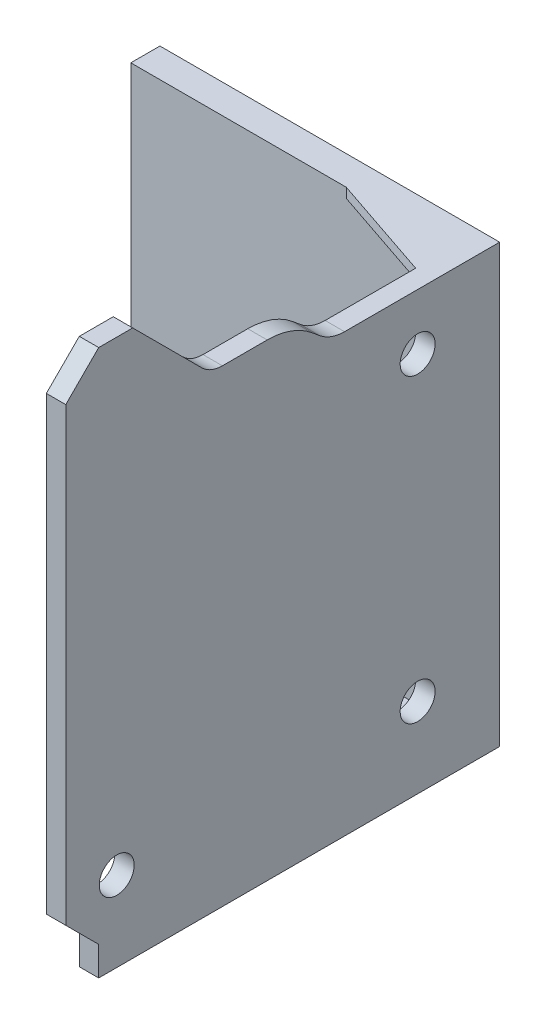
ISO-10303-21;
HEADER;
FILE_DESCRIPTION(('STEP AP214'),'2;1');
FILE_NAME('part.step','',(''),(''),'','','');
FILE_SCHEMA(('AUTOMOTIVE_DESIGN { 1 0 10303 214 1 1 1 1 }'));
ENDSEC;
DATA;
#1=APPLICATION_CONTEXT('core data for automotive mechanical design processes');
#2=APPLICATION_PROTOCOL_DEFINITION('international standard','automotive_design',2000,#1);
#3=PRODUCT_CONTEXT('',#1,'mechanical');
#4=PRODUCT('Part','Part','',(#3));
#5=PRODUCT_RELATED_PRODUCT_CATEGORY('part','',(#4));
#6=PRODUCT_DEFINITION_FORMATION('','',#4);
#7=PRODUCT_DEFINITION_CONTEXT('part definition',#1,'design');
#8=PRODUCT_DEFINITION('design','',#6,#7);
#9=PRODUCT_DEFINITION_SHAPE('','',#8);
#10=(LENGTH_UNIT() NAMED_UNIT(*) SI_UNIT(.MILLI.,.METRE.));
#11=(NAMED_UNIT(*) PLANE_ANGLE_UNIT() SI_UNIT($,.RADIAN.));
#12=(NAMED_UNIT(*) SI_UNIT($,.STERADIAN.) SOLID_ANGLE_UNIT());
#13=UNCERTAINTY_MEASURE_WITH_UNIT(LENGTH_MEASURE(1.E-05),#10,'distance_accuracy_value','');
#14=(GEOMETRIC_REPRESENTATION_CONTEXT(3) GLOBAL_UNCERTAINTY_ASSIGNED_CONTEXT((#13)) GLOBAL_UNIT_ASSIGNED_CONTEXT((#10,
#11,#12)) REPRESENTATION_CONTEXT('',''));
#15=CARTESIAN_POINT('',(0.,0.,0.));
#16=DIRECTION('',(0.,0.,1.));
#17=DIRECTION('',(1.,0.,0.));
#18=AXIS2_PLACEMENT_3D('',#15,#16,#17);
#19=CARTESIAN_POINT('',(34.8950034964941,303.179756404235,218.512693009187));
#20=DIRECTION('',(1.,0.,0.));
#21=DIRECTION('',(0.,1.,0.));
#22=AXIS2_PLACEMENT_3D('',#19,#20,#21);
#23=PLANE('',#22);
#24=DIRECTION('',(0.,0.,1.));
#25=VECTOR('',#24,1.);
#26=CARTESIAN_POINT('',(34.8950034964941,254.429756404235,212.102389971154));
#27=LINE('',#26,#25);
#28=CARTESIAN_POINT('',(34.8950034964941,254.429756404235,192.949446246001));
#29=VERTEX_POINT('',#28);
#30=CARTESIAN_POINT('',(34.8950034964941,254.429756404235,212.102389971154));
#31=VERTEX_POINT('',#30);
#32=EDGE_CURVE('E672',#29,#31,#27,.T.);
#33=ORIENTED_EDGE('',*,*,#32,.T.);
#34=DIRECTION('',(0.,-1.,0.));
#35=VECTOR('',#34,1.);
#36=CARTESIAN_POINT('',(34.8950034964941,254.429756404235,212.102389971154));
#37=LINE('',#36,#35);
#38=CARTESIAN_POINT('',(34.8950034964941,251.929756404235,212.102389971154));
#39=VERTEX_POINT('',#38);
#40=EDGE_CURVE('E208',#31,#39,#37,.T.);
#41=ORIENTED_EDGE('',*,*,#40,.T.);
#42=DIRECTION('',(0.,0.,-1.));
#43=VECTOR('',#42,1.);
#44=CARTESIAN_POINT('',(34.8950034964941,251.929756404235,192.949446246001));
#45=LINE('',#44,#43);
#46=CARTESIAN_POINT('',(34.8950034964941,251.929756404235,231.255333696306));
#47=VERTEX_POINT('',#46);
#48=EDGE_CURVE('E214',#47,#39,#45,.T.);
#49=ORIENTED_EDGE('',*,*,#48,.F.);
#50=DIRECTION('',(0.,-1.,0.));
#51=VECTOR('',#50,1.);
#52=CARTESIAN_POINT('',(34.8950034964941,254.929856404235,231.255333696306));
#53=LINE('',#52,#51);
#54=CARTESIAN_POINT('',(34.8950034964941,254.929756404235,231.255333696306));
#55=VERTEX_POINT('',#54);
#56=EDGE_CURVE('E219',#55,#47,#53,.T.);
#57=ORIENTED_EDGE('',*,*,#56,.F.);
#58=DIRECTION('',(0.,-0.707106781186553,-0.707106781186542));
#59=VECTOR('',#58,1.);
#60=CARTESIAN_POINT('',(34.8950034964941,258.32386895393,234.649446246001));
#61=LINE('',#60,#59);
#62=CARTESIAN_POINT('',(34.8950034964941,258.32386895393,234.649446246001));
#63=VERTEX_POINT('',#62);
#64=EDGE_CURVE('E270',#63,#55,#61,.T.);
#65=ORIENTED_EDGE('',*,*,#64,.F.);
#66=DIRECTION('',(0.,-1.,0.));
#67=VECTOR('',#66,1.);
#68=CARTESIAN_POINT('',(34.8950034964941,304.78564385454,234.649446246001));
#69=LINE('',#68,#67);
#70=CARTESIAN_POINT('',(34.8950034964941,304.78564385454,234.649446246001));
#71=VERTEX_POINT('',#70);
#72=EDGE_CURVE('E312',#71,#63,#69,.T.);
#73=ORIENTED_EDGE('',*,*,#72,.F.);
#74=DIRECTION('',(0.,-0.70710678118655,0.707106781186545));
#75=VECTOR('',#74,1.);
#76=CARTESIAN_POINT('',(34.8950034964941,304.78564385454,234.649446246001));
#77=LINE('',#76,#75);
#78=CARTESIAN_POINT('',(34.8950034964941,308.179756404235,231.255333696306));
#79=VERTEX_POINT('',#78);
#80=EDGE_CURVE('E310',#79,#71,#77,.T.);
#81=ORIENTED_EDGE('',*,*,#80,.F.);
#82=DIRECTION('',(0.,0.,1.));
#83=VECTOR('',#82,1.);
#84=CARTESIAN_POINT('',(34.8950034964941,308.179756404235,227.755333696306));
#85=LINE('',#84,#83);
#86=CARTESIAN_POINT('',(34.8950034964941,308.179756404235,227.755333696306));
#87=VERTEX_POINT('',#86);
#88=EDGE_CURVE('E308',#87,#79,#85,.T.);
#89=ORIENTED_EDGE('',*,*,#88,.F.);
#90=DIRECTION('',(0.,0.707106781186542,0.707106781186553));
#91=VECTOR('',#90,1.);
#92=CARTESIAN_POINT('',(34.8950034964941,308.179756404235,227.755333696306));
#93=LINE('',#92,#91);
#94=CARTESIAN_POINT('',(34.8950034964941,301.058436060675,220.634013352746));
#95=VERTEX_POINT('',#94);
#96=EDGE_CURVE('E306',#95,#87,#93,.T.);
#97=ORIENTED_EDGE('',*,*,#96,.F.);
#98=CARTESIAN_POINT('',(34.8950034964941,303.179756404235,218.512693009187));
#99=DIRECTION('',(-1.,0.,0.));
#100=DIRECTION('',(0.,1.,0.));
#101=AXIS2_PLACEMENT_3D('',#98,#99,#100);
#102=CIRCLE('',#101,3.);
#103=CARTESIAN_POINT('',(34.8950034964941,300.179756404235,218.512693009187));
#104=VERTEX_POINT('',#103);
#105=EDGE_CURVE('E303',#104,#95,#102,.T.);
#106=ORIENTED_EDGE('',*,*,#105,.F.);
#107=DIRECTION('',(0.,0.,1.));
#108=VECTOR('',#107,1.);
#109=CARTESIAN_POINT('',(34.8950034964941,300.179756404235,213.899446246001));
#110=LINE('',#109,#108);
#111=CARTESIAN_POINT('',(34.8950034964941,300.179756404235,213.899446246001));
#112=VERTEX_POINT('',#111);
#113=EDGE_CURVE('E301',#112,#104,#110,.T.);
#114=ORIENTED_EDGE('',*,*,#113,.F.);
#115=CARTESIAN_POINT('',(34.8950034964941,292.929756404235,213.899446246001));
#116=DIRECTION('',(1.,0.,0.));
#117=DIRECTION('',(0.,1.,0.));
#118=AXIS2_PLACEMENT_3D('',#115,#116,#117);
#119=CIRCLE('',#118,7.24999999999999);
#120=CARTESIAN_POINT('',(34.8950034964941,298.498018376654,209.256499056284));
#121=VERTEX_POINT('',#120);
#122=EDGE_CURVE('E299',#121,#112,#119,.T.);
#123=ORIENTED_EDGE('',*,*,#122,.F.);
#124=DIRECTION('',(0.,0.640406508926575,0.768036134126824));
#125=VECTOR('',#124,1.);
#126=CARTESIAN_POINT('',(34.8950034964941,297.857611867728,208.488462922157));
#127=LINE('',#126,#125);
#128=CARTESIAN_POINT('',(34.8950034964941,297.857611867728,208.488462922157));
#129=VERTEX_POINT('',#128);
#130=EDGE_CURVE('E297',#129,#121,#127,.T.);
#131=ORIENTED_EDGE('',*,*,#130,.F.);
#132=CARTESIAN_POINT('',(34.8950034964941,300.929756404235,205.92683688645));
#133=DIRECTION('',(-1.,0.,0.));
#134=DIRECTION('',(0.,1.,0.));
#135=AXIS2_PLACEMENT_3D('',#132,#133,#134);
#136=CIRCLE('',#135,4.00000000000001);
#137=CARTESIAN_POINT('',(34.8950034964941,296.929756404235,205.92683688645));
#138=VERTEX_POINT('',#137);
#139=EDGE_CURVE('E295',#138,#129,#136,.T.);
#140=ORIENTED_EDGE('',*,*,#139,.F.);
#141=DIRECTION('',(0.,0.,1.));
#142=VECTOR('',#141,1.);
#143=CARTESIAN_POINT('',(34.8950034964941,296.929756404235,197.649446246001));
#144=LINE('',#143,#142);
#145=CARTESIAN_POINT('',(34.8950034964941,296.929756404235,196.599446246001));
#146=VERTEX_POINT('',#145);
#147=EDGE_CURVE('E265',#146,#138,#144,.T.);
#148=ORIENTED_EDGE('',*,*,#147,.F.);
#149=DIRECTION('',(0.,1.,0.));
#150=VECTOR('',#149,1.);
#151=CARTESIAN_POINT('',(34.8950034964941,295.929756404235,196.599446246001));
#152=LINE('',#151,#150);
#153=CARTESIAN_POINT('',(34.8950034964941,295.929756404235,196.599446246001));
#154=VERTEX_POINT('',#153);
#155=EDGE_CURVE('E239',#154,#146,#152,.T.);
#156=ORIENTED_EDGE('',*,*,#155,.F.);
#157=DIRECTION('',(0.,0.,-1.));
#158=VECTOR('',#157,1.);
#159=CARTESIAN_POINT('',(34.8950034964941,295.929756404235,196.599446246001));
#160=LINE('',#159,#158);
#161=CARTESIAN_POINT('',(34.8950034964941,295.929756404235,195.449446246001));
#162=VERTEX_POINT('',#161);
#163=EDGE_CURVE('E234',#154,#162,#160,.T.);
#164=ORIENTED_EDGE('',*,*,#163,.T.);
#165=DIRECTION('',(0.,0.707106781186549,0.707106781186546));
#166=VECTOR('',#165,1.);
#167=CARTESIAN_POINT('',(34.8950034964942,50.2401550791165,-50.2401550791166));
#168=LINE('',#167,#166);
#169=CARTESIAN_POINT('',(34.8950034964941,293.429756404235,192.949446246001));
#170=VERTEX_POINT('',#169);
#171=EDGE_CURVE('E225',#170,#162,#168,.T.);
#172=ORIENTED_EDGE('',*,*,#171,.F.);
#173=DIRECTION('',(0.,1.,0.));
#174=VECTOR('',#173,1.);
#175=CARTESIAN_POINT('',(34.8950034964941,296.929756404235,192.949446246001));
#176=LINE('',#175,#174);
#177=EDGE_CURVE('E48',#29,#170,#176,.T.);
#178=ORIENTED_EDGE('',*,*,#177,.F.);
#179=EDGE_LOOP('',(#33,#41,#49,#57,#65,#73,#81,#89,#97,#106,#114,#123,#131,#140,#148,#156,#164,
#172,#178));
#180=FACE_BOUND('',#179,.T.);
#181=CARTESIAN_POINT('',(34.8950034964941,260.179756404235,229.399446246001));
#182=DIRECTION('',(1.,0.,0.));
#183=DIRECTION('',(0.,1.,0.));
#184=AXIS2_PLACEMENT_3D('',#181,#182,#183);
#185=CIRCLE('',#184,1.79999999999994);
#186=CARTESIAN_POINT('',(34.8950034964941,261.979756404235,229.399446246001));
#187=VERTEX_POINT('',#186);
#188=EDGE_CURVE('E249',#187,#187,#185,.T.);
#189=ORIENTED_EDGE('',*,*,#188,.T.);
#190=EDGE_LOOP('',(#189));
#191=FACE_BOUND('',#190,.T.);
#192=CARTESIAN_POINT('',(34.8950034964941,260.179756404235,198.399446246001));
#193=DIRECTION('',(1.,0.,0.));
#194=DIRECTION('',(0.,1.,0.));
#195=AXIS2_PLACEMENT_3D('',#192,#193,#194);
#196=CIRCLE('',#195,1.79999999999989);
#197=CARTESIAN_POINT('',(34.8950034964941,261.979756404235,198.399446246001));
#198=VERTEX_POINT('',#197);
#199=EDGE_CURVE('E253',#198,#198,#196,.T.);
#200=ORIENTED_EDGE('',*,*,#199,.T.);
#201=EDGE_LOOP('',(#200));
#202=FACE_BOUND('',#201,.T.);
#203=CARTESIAN_POINT('',(34.8950034964941,291.179756404235,198.399446246001));
#204=DIRECTION('',(1.,0.,0.));
#205=DIRECTION('',(0.,1.,0.));
#206=AXIS2_PLACEMENT_3D('',#203,#204,#205);
#207=CIRCLE('',#206,1.79999999999989);
#208=CARTESIAN_POINT('',(34.8950034964941,292.979756404235,198.399446246001));
#209=VERTEX_POINT('',#208);
#210=EDGE_CURVE('E259',#209,#209,#207,.T.);
#211=ORIENTED_EDGE('',*,*,#210,.T.);
#212=EDGE_LOOP('',(#211));
#213=FACE_BOUND('',#212,.T.);
#214=ADVANCED_FACE('F33',(#180,#191,#202,#213),#23,.F.);
#215=CARTESIAN_POINT('',(36.8950034964941,303.179756404235,218.512693009187));
#216=DIRECTION('',(1.,0.,0.));
#217=DIRECTION('',(0.,1.,0.));
#218=AXIS2_PLACEMENT_3D('',#215,#216,#217);
#219=PLANE('',#218);
#220=DIRECTION('',(0.,-0.707106781186553,-0.707106781186542));
#221=VECTOR('',#220,1.);
#222=CARTESIAN_POINT('',(36.8950034964941,258.32386895393,234.649446246001));
#223=LINE('',#222,#221);
#224=CARTESIAN_POINT('',(36.8950034964941,258.32386895393,234.649446246001));
#225=VERTEX_POINT('',#224);
#226=CARTESIAN_POINT('',(36.8950034964941,254.929756404235,231.255333696306));
#227=VERTEX_POINT('',#226);
#228=EDGE_CURVE('E290',#225,#227,#223,.T.);
#229=ORIENTED_EDGE('',*,*,#228,.T.);
#230=DIRECTION('',(0.,-1.,0.));
#231=VECTOR('',#230,1.);
#232=CARTESIAN_POINT('',(36.8950034964941,254.929856404235,231.255333696306));
#233=LINE('',#232,#231);
#234=CARTESIAN_POINT('',(36.8950034964941,251.929756404235,231.255333696306));
#235=VERTEX_POINT('',#234);
#236=EDGE_CURVE('E218',#227,#235,#233,.T.);
#237=ORIENTED_EDGE('',*,*,#236,.T.);
#238=DIRECTION('',(0.,0.,1.));
#239=VECTOR('',#238,1.);
#240=CARTESIAN_POINT('',(36.8950034964941,251.929756404235,231.255333696306));
#241=LINE('',#240,#239);
#242=CARTESIAN_POINT('',(36.8950034964941,251.929756404235,189.949446246001));
#243=VERTEX_POINT('',#242);
#244=EDGE_CURVE('E203',#243,#235,#241,.T.);
#245=ORIENTED_EDGE('',*,*,#244,.F.);
#246=DIRECTION('',(0.,1.,0.));
#247=VECTOR('',#246,1.);
#248=CARTESIAN_POINT('',(36.8950034964941,296.929756404235,189.949446246001));
#249=LINE('',#248,#247);
#250=CARTESIAN_POINT('',(36.8950034964941,296.929756404235,189.949446246001));
#251=VERTEX_POINT('',#250);
#252=EDGE_CURVE('E192',#243,#251,#249,.T.);
#253=ORIENTED_EDGE('',*,*,#252,.T.);
#254=DIRECTION('',(0.,0.,1.));
#255=VECTOR('',#254,1.);
#256=CARTESIAN_POINT('',(36.8950034964941,296.929756404235,197.649446246001));
#257=LINE('',#256,#255);
#258=CARTESIAN_POINT('',(36.8950034964941,296.929756404235,205.92683688645));
#259=VERTEX_POINT('',#258);
#260=EDGE_CURVE('E269',#251,#259,#257,.T.);
#261=ORIENTED_EDGE('',*,*,#260,.T.);
#262=CARTESIAN_POINT('',(36.8950034964941,300.929756404235,205.92683688645));
#263=DIRECTION('',(-1.,0.,0.));
#264=DIRECTION('',(0.,1.,0.));
#265=AXIS2_PLACEMENT_3D('',#262,#263,#264);
#266=CIRCLE('',#265,4.00000000000001);
#267=CARTESIAN_POINT('',(36.8950034964941,297.857611867728,208.488462922157));
#268=VERTEX_POINT('',#267);
#269=EDGE_CURVE('E272',#259,#268,#266,.T.);
#270=ORIENTED_EDGE('',*,*,#269,.T.);
#271=DIRECTION('',(0.,0.640406508926575,0.768036134126824));
#272=VECTOR('',#271,1.);
#273=CARTESIAN_POINT('',(36.8950034964941,297.857611867728,208.488462922157));
#274=LINE('',#273,#272);
#275=CARTESIAN_POINT('',(36.8950034964941,298.498018376654,209.256499056284));
#276=VERTEX_POINT('',#275);
#277=EDGE_CURVE('E274',#268,#276,#274,.T.);
#278=ORIENTED_EDGE('',*,*,#277,.T.);
#279=CARTESIAN_POINT('',(36.8950034964941,292.929756404235,213.899446246001));
#280=DIRECTION('',(1.,0.,0.));
#281=DIRECTION('',(0.,1.,0.));
#282=AXIS2_PLACEMENT_3D('',#279,#280,#281);
#283=CIRCLE('',#282,7.24999999999999);
#284=CARTESIAN_POINT('',(36.8950034964941,300.179756404235,213.899446246001));
#285=VERTEX_POINT('',#284);
#286=EDGE_CURVE('E276',#276,#285,#283,.T.);
#287=ORIENTED_EDGE('',*,*,#286,.T.);
#288=DIRECTION('',(0.,0.,1.));
#289=VECTOR('',#288,1.);
#290=CARTESIAN_POINT('',(36.8950034964941,300.179756404235,213.899446246001));
#291=LINE('',#290,#289);
#292=CARTESIAN_POINT('',(36.8950034964941,300.179756404235,218.512693009187));
#293=VERTEX_POINT('',#292);
#294=EDGE_CURVE('E278',#285,#293,#291,.T.);
#295=ORIENTED_EDGE('',*,*,#294,.T.);
#296=CARTESIAN_POINT('',(36.8950034964941,303.179756404235,218.512693009187));
#297=DIRECTION('',(-1.,0.,0.));
#298=DIRECTION('',(0.,1.,0.));
#299=AXIS2_PLACEMENT_3D('',#296,#297,#298);
#300=CIRCLE('',#299,3.);
#301=CARTESIAN_POINT('',(36.8950034964941,301.058436060675,220.634013352746));
#302=VERTEX_POINT('',#301);
#303=EDGE_CURVE('E280',#293,#302,#300,.T.);
#304=ORIENTED_EDGE('',*,*,#303,.T.);
#305=DIRECTION('',(0.,0.70710678118655,0.707106781186545));
#306=VECTOR('',#305,1.);
#307=CARTESIAN_POINT('',(36.8950034964941,301.058436060675,220.634013352746));
#308=LINE('',#307,#306);
#309=CARTESIAN_POINT('',(36.8950034964941,308.179756404235,227.755333696306));
#310=VERTEX_POINT('',#309);
#311=EDGE_CURVE('E282',#302,#310,#308,.T.);
#312=ORIENTED_EDGE('',*,*,#311,.T.);
#313=DIRECTION('',(0.,0.,1.));
#314=VECTOR('',#313,1.);
#315=CARTESIAN_POINT('',(36.8950034964941,308.179756404235,227.755333696306));
#316=LINE('',#315,#314);
#317=CARTESIAN_POINT('',(36.8950034964941,308.179756404235,231.255333696306));
#318=VERTEX_POINT('',#317);
#319=EDGE_CURVE('E284',#310,#318,#316,.T.);
#320=ORIENTED_EDGE('',*,*,#319,.T.);
#321=DIRECTION('',(0.,-0.70710678118655,0.707106781186545));
#322=VECTOR('',#321,1.);
#323=CARTESIAN_POINT('',(36.8950034964941,304.78564385454,234.649446246001));
#324=LINE('',#323,#322);
#325=CARTESIAN_POINT('',(36.8950034964941,304.78564385454,234.649446246001));
#326=VERTEX_POINT('',#325);
#327=EDGE_CURVE('E286',#318,#326,#324,.T.);
#328=ORIENTED_EDGE('',*,*,#327,.T.);
#329=DIRECTION('',(0.,-1.,0.));
#330=VECTOR('',#329,1.);
#331=CARTESIAN_POINT('',(36.8950034964941,304.78564385454,234.649446246001));
#332=LINE('',#331,#330);
#333=EDGE_CURVE('E288',#326,#225,#332,.T.);
#334=ORIENTED_EDGE('',*,*,#333,.T.);
#335=EDGE_LOOP('',(#229,#237,#245,#253,#261,#270,#278,#287,#295,#304,#312,#320,#328,#334));
#336=FACE_BOUND('',#335,.T.);
#337=CARTESIAN_POINT('',(36.8950034964941,260.179756404235,198.399446246001));
#338=DIRECTION('',(1.,0.,0.));
#339=DIRECTION('',(0.,1.,0.));
#340=AXIS2_PLACEMENT_3D('',#337,#338,#339);
#341=CIRCLE('',#340,1.79999999999989);
#342=CARTESIAN_POINT('',(36.8950034964941,261.979756404235,198.399446246001));
#343=VERTEX_POINT('',#342);
#344=EDGE_CURVE('E256',#343,#343,#341,.T.);
#345=ORIENTED_EDGE('',*,*,#344,.F.);
#346=EDGE_LOOP('',(#345));
#347=FACE_BOUND('',#346,.T.);
#348=CARTESIAN_POINT('',(36.8950034964941,291.179756404235,198.399446246001));
#349=DIRECTION('',(1.,0.,0.));
#350=DIRECTION('',(0.,1.,0.));
#351=AXIS2_PLACEMENT_3D('',#348,#349,#350);
#352=CIRCLE('',#351,1.79999999999989);
#353=CARTESIAN_POINT('',(36.8950034964941,292.979756404235,198.399446246001));
#354=VERTEX_POINT('',#353);
#355=EDGE_CURVE('E262',#354,#354,#352,.T.);
#356=ORIENTED_EDGE('',*,*,#355,.F.);
#357=EDGE_LOOP('',(#356));
#358=FACE_BOUND('',#357,.T.);
#359=CARTESIAN_POINT('',(36.8950034964941,260.179756404235,229.399446246001));
#360=DIRECTION('',(1.,0.,0.));
#361=DIRECTION('',(0.,1.,0.));
#362=AXIS2_PLACEMENT_3D('',#359,#360,#361);
#363=CIRCLE('',#362,1.79999999999994);
#364=CARTESIAN_POINT('',(36.8950034964941,261.979756404235,229.399446246001));
#365=VERTEX_POINT('',#364);
#366=EDGE_CURVE('E250',#365,#365,#363,.T.);
#367=ORIENTED_EDGE('',*,*,#366,.F.);
#368=EDGE_LOOP('',(#367));
#369=FACE_BOUND('',#368,.T.);
#370=ADVANCED_FACE('F370',(#336,#347,#358,#369),#219,.T.);
#371=CARTESIAN_POINT('',(36.8950034964941,296.929756404235,189.949446246001));
#372=DIRECTION('',(0.,0.,1.));
#373=DIRECTION('',(1.,0.,0.));
#374=AXIS2_PLACEMENT_3D('',#371,#372,#373);
#375=PLANE('',#374);
#376=DIRECTION('',(-1.,0.,0.));
#377=VECTOR('',#376,1.);
#378=CARTESIAN_POINT('',(36.8950034964941,296.929756404235,189.949446246001));
#379=LINE('',#378,#377);
#380=CARTESIAN_POINT('',(1.89500349649407,296.929756404235,189.949446246001));
#381=VERTEX_POINT('',#380);
#382=EDGE_CURVE('E11',#251,#381,#379,.T.);
#383=ORIENTED_EDGE('',*,*,#382,.F.);
#384=ORIENTED_EDGE('',*,*,#252,.F.);
#385=DIRECTION('',(-1.,0.,0.));
#386=VECTOR('',#385,1.);
#387=CARTESIAN_POINT('',(1.89500349649408,251.929756404235,189.949446246001));
#388=LINE('',#387,#386);
#389=CARTESIAN_POINT('',(1.89500349649408,251.929756404235,189.949446246001));
#390=VERTEX_POINT('',#389);
#391=EDGE_CURVE('E191',#243,#390,#388,.T.);
#392=ORIENTED_EDGE('',*,*,#391,.T.);
#393=DIRECTION('',(0.,-1.,0.));
#394=VECTOR('',#393,1.);
#395=CARTESIAN_POINT('',(1.89500349649407,296.929756404235,189.949446246001));
#396=LINE('',#395,#394);
#397=EDGE_CURVE('E179',#381,#390,#396,.T.);
#398=ORIENTED_EDGE('',*,*,#397,.F.);
#399=EDGE_LOOP('',(#383,#384,#392,#398));
#400=FACE_BOUND('',#399,.T.);
#401=ADVANCED_FACE('F35',(#400),#375,.F.);
#402=CARTESIAN_POINT('',(36.8950034964941,296.929756404235,197.649446246001));
#403=DIRECTION('',(0.,-1.,0.));
#404=DIRECTION('',(1.,0.,0.));
#405=AXIS2_PLACEMENT_3D('',#402,#403,#404);
#406=PLANE('',#405);
#407=DIRECTION('',(0.947362462683605,0.,0.320163027687545));
#408=VECTOR('',#407,1.);
#409=CARTESIAN_POINT('',(24.0946527696453,296.929756404235,192.949446246001));
#410=LINE('',#409,#408);
#411=CARTESIAN_POINT('',(24.0946527696453,296.929756404235,192.949446246001));
#412=VERTEX_POINT('',#411);
#413=EDGE_CURVE('E229',#412,#146,#410,.T.);
#414=ORIENTED_EDGE('',*,*,#413,.T.);
#415=ORIENTED_EDGE('',*,*,#147,.T.);
#416=DIRECTION('',(-1.,0.,0.));
#417=VECTOR('',#416,1.);
#418=CARTESIAN_POINT('',(36.8950034964941,296.929756404235,205.92683688645));
#419=LINE('',#418,#417);
#420=EDGE_CURVE('E41',#259,#138,#419,.T.);
#421=ORIENTED_EDGE('',*,*,#420,.F.);
#422=ORIENTED_EDGE('',*,*,#260,.F.);
#423=ORIENTED_EDGE('',*,*,#382,.T.);
#424=DIRECTION('',(0.,0.,-1.));
#425=VECTOR('',#424,1.);
#426=CARTESIAN_POINT('',(1.89500349649407,296.929756404235,192.949446246001));
#427=LINE('',#426,#425);
#428=CARTESIAN_POINT('',(1.89500349649407,296.929756404235,192.949446246001));
#429=VERTEX_POINT('',#428);
#430=EDGE_CURVE('E185',#429,#381,#427,.T.);
#431=ORIENTED_EDGE('',*,*,#430,.F.);
#432=DIRECTION('',(1.,0.,0.));
#433=VECTOR('',#432,1.);
#434=CARTESIAN_POINT('',(1.89500349649407,296.929756404235,192.949446246001));
#435=LINE('',#434,#433);
#436=EDGE_CURVE('E245',#429,#412,#435,.T.);
#437=ORIENTED_EDGE('',*,*,#436,.T.);
#438=EDGE_LOOP('',(#414,#415,#421,#422,#423,#431,#437));
#439=FACE_BOUND('',#438,.T.);
#440=ADVANCED_FACE('F373',(#439),#406,.F.);
#441=CARTESIAN_POINT('',(36.8950034964941,300.929756404235,205.92683688645));
#442=DIRECTION('',(-1.,0.,0.));
#443=DIRECTION('',(0.,-1.,0.));
#444=AXIS2_PLACEMENT_3D('',#441,#442,#443);
#445=CYLINDRICAL_SURFACE('',#444,4.00000000000001);
#446=ORIENTED_EDGE('',*,*,#139,.T.);
#447=DIRECTION('',(-1.,0.,0.));
#448=VECTOR('',#447,1.);
#449=CARTESIAN_POINT('',(36.8950034964941,297.857611867728,208.488462922157));
#450=LINE('',#449,#448);
#451=EDGE_CURVE('E341',#268,#129,#450,.T.);
#452=ORIENTED_EDGE('',*,*,#451,.F.);
#453=ORIENTED_EDGE('',*,*,#269,.F.);
#454=ORIENTED_EDGE('',*,*,#420,.T.);
#455=EDGE_LOOP('',(#446,#452,#453,#454));
#456=FACE_BOUND('',#455,.T.);
#457=ADVANCED_FACE('F348',(#456),#445,.F.);
#458=CARTESIAN_POINT('',(36.8950034964941,297.857611867728,208.488462922157));
#459=DIRECTION('',(0.,-0.768036134126824,0.640406508926575));
#460=DIRECTION('',(0.,-0.640406508926575,-0.768036134126824));
#461=AXIS2_PLACEMENT_3D('',#458,#459,#460);
#462=PLANE('',#461);
#463=ORIENTED_EDGE('',*,*,#130,.T.);
#464=DIRECTION('',(-1.,0.,0.));
#465=VECTOR('',#464,1.);
#466=CARTESIAN_POINT('',(36.8950034964941,298.498018376654,209.256499056284));
#467=LINE('',#466,#465);
#468=EDGE_CURVE('E338',#276,#121,#467,.T.);
#469=ORIENTED_EDGE('',*,*,#468,.F.);
#470=ORIENTED_EDGE('',*,*,#277,.F.);
#471=ORIENTED_EDGE('',*,*,#451,.T.);
#472=EDGE_LOOP('',(#463,#469,#470,#471));
#473=FACE_BOUND('',#472,.T.);
#474=ADVANCED_FACE('F362',(#473),#462,.F.);
#475=CARTESIAN_POINT('',(36.8950034964941,292.929756404235,213.899446246001));
#476=DIRECTION('',(-1.,0.,0.));
#477=DIRECTION('',(0.,-1.,0.));
#478=AXIS2_PLACEMENT_3D('',#475,#476,#477);
#479=CYLINDRICAL_SURFACE('',#478,7.24999999999999);
#480=ORIENTED_EDGE('',*,*,#122,.T.);
#481=DIRECTION('',(-1.,0.,0.));
#482=VECTOR('',#481,1.);
#483=CARTESIAN_POINT('',(36.8950034964941,300.179756404235,213.899446246001));
#484=LINE('',#483,#482);
#485=EDGE_CURVE('E335',#285,#112,#484,.T.);
#486=ORIENTED_EDGE('',*,*,#485,.F.);
#487=ORIENTED_EDGE('',*,*,#286,.F.);
#488=ORIENTED_EDGE('',*,*,#468,.T.);
#489=EDGE_LOOP('',(#480,#486,#487,#488));
#490=FACE_BOUND('',#489,.T.);
#491=ADVANCED_FACE('F366',(#490),#479,.T.);
#492=CARTESIAN_POINT('',(36.8950034964941,300.179756404235,213.899446246001));
#493=DIRECTION('',(0.,-1.,0.));
#494=DIRECTION('',(1.,0.,0.));
#495=AXIS2_PLACEMENT_3D('',#492,#493,#494);
#496=PLANE('',#495);
#497=ORIENTED_EDGE('',*,*,#113,.T.);
#498=DIRECTION('',(-1.,0.,0.));
#499=VECTOR('',#498,1.);
#500=CARTESIAN_POINT('',(36.8950034964941,300.179756404235,218.512693009187));
#501=LINE('',#500,#499);
#502=EDGE_CURVE('E332',#293,#104,#501,.T.);
#503=ORIENTED_EDGE('',*,*,#502,.F.);
#504=ORIENTED_EDGE('',*,*,#294,.F.);
#505=ORIENTED_EDGE('',*,*,#485,.T.);
#506=EDGE_LOOP('',(#497,#503,#504,#505));
#507=FACE_BOUND('',#506,.T.);
#508=ADVANCED_FACE('F425',(#507),#496,.F.);
#509=CARTESIAN_POINT('',(36.8950034964941,303.179756404235,218.512693009187));
#510=DIRECTION('',(-1.,0.,0.));
#511=DIRECTION('',(0.,-1.,0.));
#512=AXIS2_PLACEMENT_3D('',#509,#510,#511);
#513=CYLINDRICAL_SURFACE('',#512,3.);
#514=ORIENTED_EDGE('',*,*,#105,.T.);
#515=DIRECTION('',(-1.,0.,0.));
#516=VECTOR('',#515,1.);
#517=CARTESIAN_POINT('',(36.8950034964941,301.058436060675,220.634013352746));
#518=LINE('',#517,#516);
#519=EDGE_CURVE('E329',#302,#95,#518,.T.);
#520=ORIENTED_EDGE('',*,*,#519,.F.);
#521=ORIENTED_EDGE('',*,*,#303,.F.);
#522=ORIENTED_EDGE('',*,*,#502,.T.);
#523=EDGE_LOOP('',(#514,#520,#521,#522));
#524=FACE_BOUND('',#523,.T.);
#525=ADVANCED_FACE('F421',(#524),#513,.F.);
#526=CARTESIAN_POINT('',(36.8950034964941,308.179756404235,227.755333696306));
#527=DIRECTION('',(0.,-0.707106781186553,0.707106781186542));
#528=DIRECTION('',(0.,-0.707106781186542,-0.707106781186553));
#529=AXIS2_PLACEMENT_3D('',#526,#527,#528);
#530=PLANE('',#529);
#531=ORIENTED_EDGE('',*,*,#96,.T.);
#532=DIRECTION('',(-1.,0.,0.));
#533=VECTOR('',#532,1.);
#534=CARTESIAN_POINT('',(36.8950034964941,308.179756404235,227.755333696306));
#535=LINE('',#534,#533);
#536=EDGE_CURVE('E326',#310,#87,#535,.T.);
#537=ORIENTED_EDGE('',*,*,#536,.F.);
#538=ORIENTED_EDGE('',*,*,#311,.F.);
#539=ORIENTED_EDGE('',*,*,#519,.T.);
#540=EDGE_LOOP('',(#531,#537,#538,#539));
#541=FACE_BOUND('',#540,.T.);
#542=ADVANCED_FACE('F417',(#541),#530,.F.);
#543=CARTESIAN_POINT('',(36.8950034964941,308.179756404235,227.755333696306));
#544=DIRECTION('',(0.,-1.,0.));
#545=DIRECTION('',(1.,0.,0.));
#546=AXIS2_PLACEMENT_3D('',#543,#544,#545);
#547=PLANE('',#546);
#548=ORIENTED_EDGE('',*,*,#88,.T.);
#549=DIRECTION('',(-1.,0.,0.));
#550=VECTOR('',#549,1.);
#551=CARTESIAN_POINT('',(36.8950034964941,308.179756404235,231.255333696306));
#552=LINE('',#551,#550);
#553=EDGE_CURVE('E323',#318,#79,#552,.T.);
#554=ORIENTED_EDGE('',*,*,#553,.F.);
#555=ORIENTED_EDGE('',*,*,#319,.F.);
#556=ORIENTED_EDGE('',*,*,#536,.T.);
#557=EDGE_LOOP('',(#548,#554,#555,#556));
#558=FACE_BOUND('',#557,.T.);
#559=ADVANCED_FACE('F413',(#558),#547,.F.);
#560=CARTESIAN_POINT('',(36.8950034964941,304.78564385454,234.649446246001));
#561=DIRECTION('',(0.,-0.707106781186545,-0.70710678118655));
#562=DIRECTION('',(0.,0.70710678118655,-0.707106781186545));
#563=AXIS2_PLACEMENT_3D('',#560,#561,#562);
#564=PLANE('',#563);
#565=ORIENTED_EDGE('',*,*,#80,.T.);
#566=DIRECTION('',(-1.,0.,0.));
#567=VECTOR('',#566,1.);
#568=CARTESIAN_POINT('',(36.8950034964941,304.78564385454,234.649446246001));
#569=LINE('',#568,#567);
#570=EDGE_CURVE('E320',#326,#71,#569,.T.);
#571=ORIENTED_EDGE('',*,*,#570,.F.);
#572=ORIENTED_EDGE('',*,*,#327,.F.);
#573=ORIENTED_EDGE('',*,*,#553,.T.);
#574=EDGE_LOOP('',(#565,#571,#572,#573));
#575=FACE_BOUND('',#574,.T.);
#576=ADVANCED_FACE('F409',(#575),#564,.F.);
#577=CARTESIAN_POINT('',(36.8950034964941,304.78564385454,234.649446246001));
#578=DIRECTION('',(0.,0.,-1.));
#579=DIRECTION('',(-1.,0.,0.));
#580=AXIS2_PLACEMENT_3D('',#577,#578,#579);
#581=PLANE('',#580);
#582=ORIENTED_EDGE('',*,*,#72,.T.);
#583=DIRECTION('',(-1.,0.,0.));
#584=VECTOR('',#583,1.);
#585=CARTESIAN_POINT('',(36.8950034964941,258.32386895393,234.649446246001));
#586=LINE('',#585,#584);
#587=EDGE_CURVE('E317',#225,#63,#586,.T.);
#588=ORIENTED_EDGE('',*,*,#587,.F.);
#589=ORIENTED_EDGE('',*,*,#333,.F.);
#590=ORIENTED_EDGE('',*,*,#570,.T.);
#591=EDGE_LOOP('',(#582,#588,#589,#590));
#592=FACE_BOUND('',#591,.T.);
#593=ADVANCED_FACE('F405',(#592),#581,.F.);
#594=CARTESIAN_POINT('',(36.8950034964941,258.32386895393,234.649446246001));
#595=DIRECTION('',(0.,0.707106781186542,-0.707106781186553));
#596=DIRECTION('',(0.,0.707106781186553,0.707106781186542));
#597=AXIS2_PLACEMENT_3D('',#594,#595,#596);
#598=PLANE('',#597);
#599=ORIENTED_EDGE('',*,*,#64,.T.);
#600=DIRECTION('',(-1.,0.,0.));
#601=VECTOR('',#600,1.);
#602=CARTESIAN_POINT('',(36.8950034964941,254.929756404235,231.255333696306));
#603=LINE('',#602,#601);
#604=EDGE_CURVE('E293',#227,#55,#603,.T.);
#605=ORIENTED_EDGE('',*,*,#604,.F.);
#606=ORIENTED_EDGE('',*,*,#228,.F.);
#607=ORIENTED_EDGE('',*,*,#587,.T.);
#608=EDGE_LOOP('',(#599,#605,#606,#607));
#609=FACE_BOUND('',#608,.T.);
#610=ADVANCED_FACE('F401',(#609),#598,.F.);
#611=CARTESIAN_POINT('',(36.8950034964941,291.179756404235,198.399446246001));
#612=DIRECTION('',(-1.,0.,0.));
#613=DIRECTION('',(0.,-1.,0.));
#614=AXIS2_PLACEMENT_3D('',#611,#612,#613);
#615=CYLINDRICAL_SURFACE('',#614,1.79999999999989);
#616=ORIENTED_EDGE('',*,*,#355,.T.);
#617=EDGE_LOOP('',(#616));
#618=FACE_BOUND('',#617,.T.);
#619=ORIENTED_EDGE('',*,*,#210,.F.);
#620=EDGE_LOOP('',(#619));
#621=FACE_BOUND('',#620,.T.);
#622=ADVANCED_FACE('F404',(#618,#621),#615,.F.);
#623=CARTESIAN_POINT('',(36.8950034964941,260.179756404235,198.399446246001));
#624=DIRECTION('',(-1.,0.,0.));
#625=DIRECTION('',(0.,-1.,0.));
#626=AXIS2_PLACEMENT_3D('',#623,#624,#625);
#627=CYLINDRICAL_SURFACE('',#626,1.79999999999989);
#628=ORIENTED_EDGE('',*,*,#344,.T.);
#629=EDGE_LOOP('',(#628));
#630=FACE_BOUND('',#629,.T.);
#631=ORIENTED_EDGE('',*,*,#199,.F.);
#632=EDGE_LOOP('',(#631));
#633=FACE_BOUND('',#632,.T.);
#634=ADVANCED_FACE('F535',(#630,#633),#627,.F.);
#635=CARTESIAN_POINT('',(36.8950034964941,260.179756404235,229.399446246001));
#636=DIRECTION('',(-1.,0.,0.));
#637=DIRECTION('',(0.,-1.,0.));
#638=AXIS2_PLACEMENT_3D('',#635,#636,#637);
#639=CYLINDRICAL_SURFACE('',#638,1.79999999999994);
#640=ORIENTED_EDGE('',*,*,#366,.T.);
#641=EDGE_LOOP('',(#640));
#642=FACE_BOUND('',#641,.T.);
#643=ORIENTED_EDGE('',*,*,#188,.F.);
#644=EDGE_LOOP('',(#643));
#645=FACE_BOUND('',#644,.T.);
#646=ADVANCED_FACE('F478',(#642,#645),#639,.F.);
#647=CARTESIAN_POINT('',(1.89500349649407,296.929756404235,192.949446246001));
#648=DIRECTION('',(0.,0.,-1.));
#649=DIRECTION('',(-1.,0.,0.));
#650=AXIS2_PLACEMENT_3D('',#647,#648,#649);
#651=PLANE('',#650);
#652=DIRECTION('',(-1.,0.,0.));
#653=VECTOR('',#652,1.);
#654=CARTESIAN_POINT('',(1.89500349649408,251.929756404235,192.949446246001));
#655=LINE('',#654,#653);
#656=CARTESIAN_POINT('',(11.7958879640213,251.929756404235,192.949446246001));
#657=VERTEX_POINT('',#656);
#658=CARTESIAN_POINT('',(1.89500349649408,251.929756404235,192.949446246001));
#659=VERTEX_POINT('',#658);
#660=EDGE_CURVE('E201',#657,#659,#655,.T.);
#661=ORIENTED_EDGE('',*,*,#660,.F.);
#662=DIRECTION('',(0.,-1.,0.));
#663=VECTOR('',#662,1.);
#664=CARTESIAN_POINT('',(11.7958879640213,254.429756404235,192.949446246001));
#665=LINE('',#664,#663);
#666=CARTESIAN_POINT('',(11.7958879640213,254.429756404235,192.949446246001));
#667=VERTEX_POINT('',#666);
#668=EDGE_CURVE('E204',#667,#657,#665,.T.);
#669=ORIENTED_EDGE('',*,*,#668,.F.);
#670=DIRECTION('',(1.,0.,0.));
#671=VECTOR('',#670,1.);
#672=CARTESIAN_POINT('',(34.8950034964941,254.429756404235,192.949446246001));
#673=LINE('',#672,#671);
#674=EDGE_CURVE('E668',#667,#29,#673,.T.);
#675=ORIENTED_EDGE('',*,*,#674,.T.);
#676=ORIENTED_EDGE('',*,*,#177,.T.);
#677=DIRECTION('',(0.707106781186547,-0.707106781186547,0.));
#678=VECTOR('',#677,1.);
#679=CARTESIAN_POINT('',(164.162379950365,164.162379950365,192.949446246001));
#680=LINE('',#679,#678);
#681=CARTESIAN_POINT('',(32.3950034964943,295.929756404235,192.949446246001));
#682=VERTEX_POINT('',#681);
#683=EDGE_CURVE('E221',#682,#170,#680,.T.);
#684=ORIENTED_EDGE('',*,*,#683,.F.);
#685=DIRECTION('',(-1.,0.,0.));
#686=VECTOR('',#685,1.);
#687=CARTESIAN_POINT('',(34.8950034964941,295.929756404235,192.949446246001));
#688=LINE('',#687,#686);
#689=CARTESIAN_POINT('',(24.0946527696453,295.929756404235,192.949446246001));
#690=VERTEX_POINT('',#689);
#691=EDGE_CURVE('E230',#682,#690,#688,.T.);
#692=ORIENTED_EDGE('',*,*,#691,.T.);
#693=DIRECTION('',(0.,1.,0.));
#694=VECTOR('',#693,1.);
#695=CARTESIAN_POINT('',(24.0946527696453,295.929756404235,192.949446246001));
#696=LINE('',#695,#694);
#697=EDGE_CURVE('E236',#690,#412,#696,.T.);
#698=ORIENTED_EDGE('',*,*,#697,.T.);
#699=ORIENTED_EDGE('',*,*,#436,.F.);
#700=DIRECTION('',(0.,1.,0.));
#701=VECTOR('',#700,1.);
#702=CARTESIAN_POINT('',(1.89500349649408,254.929756404235,192.949446246001));
#703=LINE('',#702,#701);
#704=EDGE_CURVE('E188',#659,#429,#703,.T.);
#705=ORIENTED_EDGE('',*,*,#704,.F.);
#706=EDGE_LOOP('',(#661,#669,#675,#676,#684,#692,#698,#699,#705));
#707=FACE_BOUND('',#706,.T.);
#708=ADVANCED_FACE('F375',(#707),#651,.F.);
#709=CARTESIAN_POINT('',(1.89500349649416,0.,0.));
#710=DIRECTION('',(-1.,0.,0.));
#711=DIRECTION('',(0.,-1.,0.));
#712=AXIS2_PLACEMENT_3D('',#709,#710,#711);
#713=PLANE('',#712);
#714=ORIENTED_EDGE('',*,*,#397,.T.);
#715=DIRECTION('',(0.,0.,-1.));
#716=VECTOR('',#715,1.);
#717=CARTESIAN_POINT('',(1.89500349649408,251.929756404235,170.050153100117));
#718=LINE('',#717,#716);
#719=EDGE_CURVE('E183',#659,#390,#718,.T.);
#720=ORIENTED_EDGE('',*,*,#719,.F.);
#721=ORIENTED_EDGE('',*,*,#704,.T.);
#722=ORIENTED_EDGE('',*,*,#430,.T.);
#723=EDGE_LOOP('',(#714,#720,#721,#722));
#724=FACE_BOUND('',#723,.T.);
#725=ADVANCED_FACE('F181',(#724),#713,.T.);
#726=CARTESIAN_POINT('',(24.0946527696453,295.929756404235,192.949446246001));
#727=DIRECTION('',(-0.320163027687545,0.,0.947362462683605));
#728=DIRECTION('',(0.947362462683605,0.,0.320163027687545));
#729=AXIS2_PLACEMENT_3D('',#726,#727,#728);
#730=PLANE('',#729);
#731=ORIENTED_EDGE('',*,*,#413,.F.);
#732=ORIENTED_EDGE('',*,*,#697,.F.);
#733=DIRECTION('',(0.947362462683605,0.,0.320163027687545));
#734=VECTOR('',#733,1.);
#735=CARTESIAN_POINT('',(24.0946527696453,295.929756404235,192.949446246001));
#736=LINE('',#735,#734);
#737=EDGE_CURVE('E232',#690,#154,#736,.T.);
#738=ORIENTED_EDGE('',*,*,#737,.T.);
#739=ORIENTED_EDGE('',*,*,#155,.T.);
#740=EDGE_LOOP('',(#731,#732,#738,#739));
#741=FACE_BOUND('',#740,.T.);
#742=ADVANCED_FACE('F379',(#741),#730,.T.);
#743=CARTESIAN_POINT('',(0.,295.929756404235,0.));
#744=DIRECTION('',(0.,-1.,0.));
#745=DIRECTION('',(0.,0.,-1.));
#746=AXIS2_PLACEMENT_3D('',#743,#744,#745);
#747=PLANE('',#746);
#748=DIRECTION('',(0.707106781186548,0.,0.707106781186547));
#749=VECTOR('',#748,1.);
#750=CARTESIAN_POINT('',(-80.2772213747536,295.929756404235,80.2772213747538));
#751=LINE('',#750,#749);
#752=EDGE_CURVE('E56',#682,#162,#751,.T.);
#753=ORIENTED_EDGE('',*,*,#752,.T.);
#754=ORIENTED_EDGE('',*,*,#163,.F.);
#755=ORIENTED_EDGE('',*,*,#737,.F.);
#756=ORIENTED_EDGE('',*,*,#691,.F.);
#757=EDGE_LOOP('',(#753,#754,#755,#756));
#758=FACE_BOUND('',#757,.T.);
#759=ADVANCED_FACE('F380',(#758),#747,.T.);
#760=CARTESIAN_POINT('',(45.1251045515757,45.1251045515757,-45.1251045515758));
#761=DIRECTION('',(-0.577350269189625,-0.577350269189625,0.577350269189627));
#762=DIRECTION('',(0.707106781186548,0.,0.707106781186547));
#763=AXIS2_PLACEMENT_3D('',#760,#761,#762);
#764=PLANE('',#763);
#765=ORIENTED_EDGE('',*,*,#752,.F.);
#766=ORIENTED_EDGE('',*,*,#683,.T.);
#767=ORIENTED_EDGE('',*,*,#171,.T.);
#768=EDGE_LOOP('',(#765,#766,#767));
#769=FACE_BOUND('',#768,.T.);
#770=ADVANCED_FACE('F382',(#769),#764,.T.);
#771=CARTESIAN_POINT('',(34.8950034964941,254.929856404235,231.255333696306));
#772=DIRECTION('',(0.,0.,1.));
#773=DIRECTION('',(1.,0.,0.));
#774=AXIS2_PLACEMENT_3D('',#771,#772,#773);
#775=PLANE('',#774);
#776=ORIENTED_EDGE('',*,*,#604,.T.);
#777=ORIENTED_EDGE('',*,*,#56,.T.);
#778=DIRECTION('',(-1.,0.,0.));
#779=VECTOR('',#778,1.);
#780=CARTESIAN_POINT('',(34.8950034964941,251.929756404235,231.255333696306));
#781=LINE('',#780,#779);
#782=EDGE_CURVE('E206',#235,#47,#781,.T.);
#783=ORIENTED_EDGE('',*,*,#782,.F.);
#784=ORIENTED_EDGE('',*,*,#236,.F.);
#785=EDGE_LOOP('',(#776,#777,#783,#784));
#786=FACE_BOUND('',#785,.T.);
#787=ADVANCED_FACE('F384',(#786),#775,.T.);
#788=CARTESIAN_POINT('',(0.,251.929756404235,0.));
#789=DIRECTION('',(0.,1.,0.));
#790=DIRECTION('',(0.,0.,1.));
#791=AXIS2_PLACEMENT_3D('',#788,#789,#790);
#792=PLANE('',#791);
#793=ORIENTED_EDGE('',*,*,#719,.T.);
#794=ORIENTED_EDGE('',*,*,#391,.F.);
#795=ORIENTED_EDGE('',*,*,#244,.T.);
#796=ORIENTED_EDGE('',*,*,#782,.T.);
#797=ORIENTED_EDGE('',*,*,#48,.T.);
#798=DIRECTION('',(-0.769797592853029,0.,-0.638288074491199));
#799=VECTOR('',#798,1.);
#800=CARTESIAN_POINT('',(11.7958879640213,251.929756404235,192.949446246001));
#801=LINE('',#800,#799);
#802=EDGE_CURVE('E196',#39,#657,#801,.T.);
#803=ORIENTED_EDGE('',*,*,#802,.T.);
#804=ORIENTED_EDGE('',*,*,#660,.T.);
#805=EDGE_LOOP('',(#793,#794,#795,#796,#797,#803,#804));
#806=FACE_BOUND('',#805,.T.);
#807=ADVANCED_FACE('F198',(#806),#792,.F.);
#808=CARTESIAN_POINT('',(11.7958879640213,254.429756404235,192.949446246001));
#809=DIRECTION('',(-0.638288074491199,0.,0.769797592853029));
#810=DIRECTION('',(0.769797592853029,0.,0.638288074491199));
#811=AXIS2_PLACEMENT_3D('',#808,#809,#810);
#812=PLANE('',#811);
#813=ORIENTED_EDGE('',*,*,#802,.F.);
#814=ORIENTED_EDGE('',*,*,#40,.F.);
#815=DIRECTION('',(-0.769797592853029,0.,-0.638288074491199));
#816=VECTOR('',#815,1.);
#817=CARTESIAN_POINT('',(11.7958879640213,254.429756404235,192.949446246001));
#818=LINE('',#817,#816);
#819=EDGE_CURVE('E673',#31,#667,#818,.T.);
#820=ORIENTED_EDGE('',*,*,#819,.T.);
#821=ORIENTED_EDGE('',*,*,#668,.T.);
#822=EDGE_LOOP('',(#813,#814,#820,#821));
#823=FACE_BOUND('',#822,.T.);
#824=ADVANCED_FACE('F459',(#823),#812,.T.);
#825=CARTESIAN_POINT('',(0.,254.429756404235,0.));
#826=DIRECTION('',(0.,-1.,0.));
#827=DIRECTION('',(0.,0.,-1.));
#828=AXIS2_PLACEMENT_3D('',#825,#826,#827);
#829=PLANE('',#828);
#830=ORIENTED_EDGE('',*,*,#674,.F.);
#831=ORIENTED_EDGE('',*,*,#819,.F.);
#832=ORIENTED_EDGE('',*,*,#32,.F.);
#833=EDGE_LOOP('',(#830,#831,#832));
#834=FACE_BOUND('',#833,.T.);
#835=ADVANCED_FACE('F454',(#834),#829,.F.);
#836=CLOSED_SHELL('',(#214,#370,#401,#440,#457,#474,#491,#508,#525,#542,#559,#576,#593,#610,
#622,#634,#646,#708,#725,#742,#759,#770,#787,#807,#824,#835));
#837=MANIFOLD_SOLID_BREP('B2',#836);
#838=ADVANCED_BREP_SHAPE_REPRESENTATION('',(#18,#837),#14);
#839=SHAPE_DEFINITION_REPRESENTATION(#9,#838);
ENDSEC;
END-ISO-10303-21;
